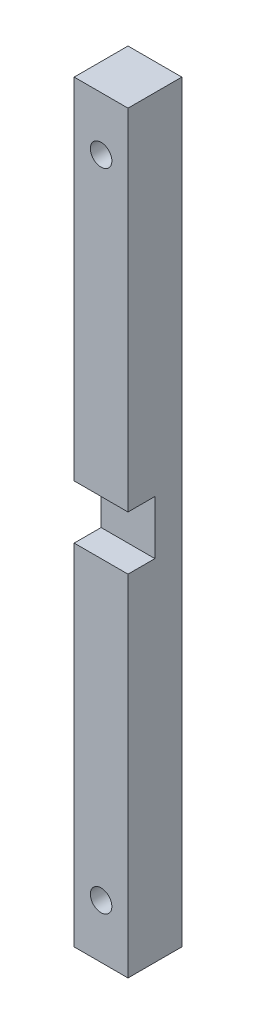
ISO-10303-21;
HEADER;
FILE_DESCRIPTION(('STEP AP214'),'2;1');
FILE_NAME('part.step','',(''),(''),'','','');
FILE_SCHEMA(('AUTOMOTIVE_DESIGN { 1 0 10303 214 1 1 1 1 }'));
ENDSEC;
DATA;
#1=APPLICATION_CONTEXT('core data for automotive mechanical design processes');
#2=APPLICATION_PROTOCOL_DEFINITION('international standard','automotive_design',2000,#1);
#3=PRODUCT_CONTEXT('',#1,'mechanical');
#4=PRODUCT('Part','Part','',(#3));
#5=PRODUCT_RELATED_PRODUCT_CATEGORY('part','',(#4));
#6=PRODUCT_DEFINITION_FORMATION('','',#4);
#7=PRODUCT_DEFINITION_CONTEXT('part definition',#1,'design');
#8=PRODUCT_DEFINITION('design','',#6,#7);
#9=PRODUCT_DEFINITION_SHAPE('','',#8);
#10=(LENGTH_UNIT() NAMED_UNIT(*) SI_UNIT(.MILLI.,.METRE.));
#11=(NAMED_UNIT(*) PLANE_ANGLE_UNIT() SI_UNIT($,.RADIAN.));
#12=(NAMED_UNIT(*) SI_UNIT($,.STERADIAN.) SOLID_ANGLE_UNIT());
#13=UNCERTAINTY_MEASURE_WITH_UNIT(LENGTH_MEASURE(1.E-05),#10,'distance_accuracy_value','');
#14=(GEOMETRIC_REPRESENTATION_CONTEXT(3) GLOBAL_UNCERTAINTY_ASSIGNED_CONTEXT((#13)) GLOBAL_UNIT_ASSIGNED_CONTEXT((#10,
#11,#12)) REPRESENTATION_CONTEXT('',''));
#15=CARTESIAN_POINT('',(0.,0.,0.));
#16=DIRECTION('',(0.,0.,1.));
#17=DIRECTION('',(1.,0.,0.));
#18=AXIS2_PLACEMENT_3D('',#15,#16,#17);
#19=CARTESIAN_POINT('',(0.,0.,10.));
#20=DIRECTION('',(0.,0.,1.));
#21=DIRECTION('',(1.,0.,0.));
#22=AXIS2_PLACEMENT_3D('',#19,#20,#21);
#23=PLANE('',#22);
#24=DIRECTION('',(1.,0.,0.));
#25=VECTOR('',#24,1.);
#26=CARTESIAN_POINT('',(10.,-75.,10.));
#27=LINE('',#26,#25);
#28=CARTESIAN_POINT('',(0.,-75.,10.));
#29=VERTEX_POINT('',#28);
#30=CARTESIAN_POINT('',(10.,-75.,10.));
#31=VERTEX_POINT('',#30);
#32=EDGE_CURVE('E119',#29,#31,#27,.T.);
#33=ORIENTED_EDGE('',*,*,#32,.F.);
#34=DIRECTION('',(0.,-1.,0.));
#35=VECTOR('',#34,1.);
#36=CARTESIAN_POINT('',(0.,0.,10.));
#37=LINE('',#36,#35);
#38=CARTESIAN_POINT('',(0.,-140.,10.));
#39=VERTEX_POINT('',#38);
#40=EDGE_CURVE('E92',#29,#39,#37,.T.);
#41=ORIENTED_EDGE('',*,*,#40,.T.);
#42=DIRECTION('',(1.,0.,0.));
#43=VECTOR('',#42,1.);
#44=CARTESIAN_POINT('',(0.,-140.,10.));
#45=LINE('',#44,#43);
#46=CARTESIAN_POINT('',(10.,-140.,10.));
#47=VERTEX_POINT('',#46);
#48=EDGE_CURVE('E159',#39,#47,#45,.T.);
#49=ORIENTED_EDGE('',*,*,#48,.T.);
#50=DIRECTION('',(0.,1.,0.));
#51=VECTOR('',#50,1.);
#52=CARTESIAN_POINT('',(10.,0.,10.));
#53=LINE('',#52,#51);
#54=EDGE_CURVE('E162',#47,#31,#53,.T.);
#55=ORIENTED_EDGE('',*,*,#54,.T.);
#56=EDGE_LOOP('',(#33,#41,#49,#55));
#57=FACE_BOUND('',#56,.T.);
#58=CARTESIAN_POINT('',(5.,-130.,10.));
#59=DIRECTION('',(0.,0.,1.));
#60=DIRECTION('',(1.,0.,0.));
#61=AXIS2_PLACEMENT_3D('',#58,#59,#60);
#62=CIRCLE('',#61,2.);
#63=CARTESIAN_POINT('',(7.,-130.,10.));
#64=VERTEX_POINT('',#63);
#65=EDGE_CURVE('E146',#64,#64,#62,.T.);
#66=ORIENTED_EDGE('',*,*,#65,.F.);
#67=EDGE_LOOP('',(#66));
#68=FACE_BOUND('',#67,.T.);
#69=ADVANCED_FACE('F37',(#57,#68),#23,.T.);
#70=CARTESIAN_POINT('',(0.,0.,10.));
#71=DIRECTION('',(1.,0.,0.));
#72=DIRECTION('',(0.,1.,0.));
#73=AXIS2_PLACEMENT_3D('',#70,#71,#72);
#74=PLANE('',#73);
#75=ORIENTED_EDGE('',*,*,#40,.F.);
#76=DIRECTION('',(0.,0.,1.));
#77=VECTOR('',#76,1.);
#78=CARTESIAN_POINT('',(0.,-75.,5.));
#79=LINE('',#78,#77);
#80=CARTESIAN_POINT('',(0.,-75.,5.));
#81=VERTEX_POINT('',#80);
#82=EDGE_CURVE('E144',#81,#29,#79,.T.);
#83=ORIENTED_EDGE('',*,*,#82,.F.);
#84=DIRECTION('',(0.,-1.,0.));
#85=VECTOR('',#84,1.);
#86=CARTESIAN_POINT('',(0.,-65.,5.));
#87=LINE('',#86,#85);
#88=CARTESIAN_POINT('',(0.,-65.,5.));
#89=VERTEX_POINT('',#88);
#90=EDGE_CURVE('E124',#89,#81,#87,.T.);
#91=ORIENTED_EDGE('',*,*,#90,.F.);
#92=DIRECTION('',(0.,0.,1.));
#93=VECTOR('',#92,1.);
#94=CARTESIAN_POINT('',(0.,-65.,5.));
#95=LINE('',#94,#93);
#96=CARTESIAN_POINT('',(0.,-65.,10.));
#97=VERTEX_POINT('',#96);
#98=EDGE_CURVE('E147',#89,#97,#95,.T.);
#99=ORIENTED_EDGE('',*,*,#98,.T.);
#100=CARTESIAN_POINT('',(0.,0.,10.));
#101=VERTEX_POINT('',#100);
#102=EDGE_CURVE('E157',#101,#97,#37,.T.);
#103=ORIENTED_EDGE('',*,*,#102,.F.);
#104=DIRECTION('',(0.,0.,-1.));
#105=VECTOR('',#104,1.);
#106=CARTESIAN_POINT('',(0.,0.,10.));
#107=LINE('',#106,#105);
#108=CARTESIAN_POINT('',(0.,0.,0.));
#109=VERTEX_POINT('',#108);
#110=EDGE_CURVE('E165',#101,#109,#107,.T.);
#111=ORIENTED_EDGE('',*,*,#110,.T.);
#112=DIRECTION('',(0.,-1.,0.));
#113=VECTOR('',#112,1.);
#114=CARTESIAN_POINT('',(0.,0.,0.));
#115=LINE('',#114,#113);
#116=CARTESIAN_POINT('',(0.,-140.,0.));
#117=VERTEX_POINT('',#116);
#118=EDGE_CURVE('E166',#109,#117,#115,.T.);
#119=ORIENTED_EDGE('',*,*,#118,.T.);
#120=DIRECTION('',(0.,0.,-1.));
#121=VECTOR('',#120,1.);
#122=CARTESIAN_POINT('',(0.,-140.,10.));
#123=LINE('',#122,#121);
#124=EDGE_CURVE('E11',#39,#117,#123,.T.);
#125=ORIENTED_EDGE('',*,*,#124,.F.);
#126=EDGE_LOOP('',(#75,#83,#91,#99,#103,#111,#119,#125));
#127=FACE_BOUND('',#126,.T.);
#128=ADVANCED_FACE('F39',(#127),#74,.F.);
#129=CARTESIAN_POINT('',(0.,-140.,10.));
#130=DIRECTION('',(0.,1.,0.));
#131=DIRECTION('',(0.,0.,1.));
#132=AXIS2_PLACEMENT_3D('',#129,#130,#131);
#133=PLANE('',#132);
#134=DIRECTION('',(1.,0.,0.));
#135=VECTOR('',#134,1.);
#136=CARTESIAN_POINT('',(0.,-140.,0.));
#137=LINE('',#136,#135);
#138=CARTESIAN_POINT('',(10.,-140.,0.));
#139=VERTEX_POINT('',#138);
#140=EDGE_CURVE('E169',#117,#139,#137,.T.);
#141=ORIENTED_EDGE('',*,*,#140,.T.);
#142=DIRECTION('',(0.,0.,-1.));
#143=VECTOR('',#142,1.);
#144=CARTESIAN_POINT('',(10.,-140.,10.));
#145=LINE('',#144,#143);
#146=EDGE_CURVE('E46',#47,#139,#145,.T.);
#147=ORIENTED_EDGE('',*,*,#146,.F.);
#148=ORIENTED_EDGE('',*,*,#48,.F.);
#149=ORIENTED_EDGE('',*,*,#124,.T.);
#150=EDGE_LOOP('',(#141,#147,#148,#149));
#151=FACE_BOUND('',#150,.T.);
#152=ADVANCED_FACE('F205',(#151),#133,.F.);
#153=CARTESIAN_POINT('',(10.,0.,10.));
#154=DIRECTION('',(-1.,0.,0.));
#155=DIRECTION('',(0.,-1.,0.));
#156=AXIS2_PLACEMENT_3D('',#153,#154,#155);
#157=PLANE('',#156);
#158=DIRECTION('',(0.,1.,0.));
#159=VECTOR('',#158,1.);
#160=CARTESIAN_POINT('',(10.,-65.,5.));
#161=LINE('',#160,#159);
#162=CARTESIAN_POINT('',(10.,-75.,5.));
#163=VERTEX_POINT('',#162);
#164=CARTESIAN_POINT('',(10.,-65.,5.));
#165=VERTEX_POINT('',#164);
#166=EDGE_CURVE('E130',#163,#165,#161,.T.);
#167=ORIENTED_EDGE('',*,*,#166,.F.);
#168=DIRECTION('',(0.,0.,1.));
#169=VECTOR('',#168,1.);
#170=CARTESIAN_POINT('',(10.,-75.,5.));
#171=LINE('',#170,#169);
#172=EDGE_CURVE('E114',#163,#31,#171,.T.);
#173=ORIENTED_EDGE('',*,*,#172,.T.);
#174=ORIENTED_EDGE('',*,*,#54,.F.);
#175=ORIENTED_EDGE('',*,*,#146,.T.);
#176=DIRECTION('',(0.,1.,0.));
#177=VECTOR('',#176,1.);
#178=CARTESIAN_POINT('',(10.,0.,0.));
#179=LINE('',#178,#177);
#180=CARTESIAN_POINT('',(10.,0.,0.));
#181=VERTEX_POINT('',#180);
#182=EDGE_CURVE('E171',#139,#181,#179,.T.);
#183=ORIENTED_EDGE('',*,*,#182,.T.);
#184=DIRECTION('',(0.,0.,-1.));
#185=VECTOR('',#184,1.);
#186=CARTESIAN_POINT('',(10.,0.,10.));
#187=LINE('',#186,#185);
#188=CARTESIAN_POINT('',(10.,0.,10.));
#189=VERTEX_POINT('',#188);
#190=EDGE_CURVE('E175',#189,#181,#187,.T.);
#191=ORIENTED_EDGE('',*,*,#190,.F.);
#192=CARTESIAN_POINT('',(10.,-65.,10.));
#193=VERTEX_POINT('',#192);
#194=EDGE_CURVE('E161',#193,#189,#53,.T.);
#195=ORIENTED_EDGE('',*,*,#194,.F.);
#196=DIRECTION('',(0.,0.,1.));
#197=VECTOR('',#196,1.);
#198=CARTESIAN_POINT('',(10.,-65.,5.));
#199=LINE('',#198,#197);
#200=EDGE_CURVE('E54',#165,#193,#199,.T.);
#201=ORIENTED_EDGE('',*,*,#200,.F.);
#202=EDGE_LOOP('',(#167,#173,#174,#175,#183,#191,#195,#201));
#203=FACE_BOUND('',#202,.T.);
#204=ADVANCED_FACE('F135',(#203),#157,.F.);
#205=CARTESIAN_POINT('',(0.,0.,10.));
#206=DIRECTION('',(0.,-1.,0.));
#207=DIRECTION('',(0.,0.,-1.));
#208=AXIS2_PLACEMENT_3D('',#205,#206,#207);
#209=PLANE('',#208);
#210=DIRECTION('',(-1.,0.,0.));
#211=VECTOR('',#210,1.);
#212=CARTESIAN_POINT('',(0.,0.,0.));
#213=LINE('',#212,#211);
#214=EDGE_CURVE('E84',#181,#109,#213,.T.);
#215=ORIENTED_EDGE('',*,*,#214,.T.);
#216=ORIENTED_EDGE('',*,*,#110,.F.);
#217=DIRECTION('',(-1.,0.,0.));
#218=VECTOR('',#217,1.);
#219=CARTESIAN_POINT('',(0.,0.,10.));
#220=LINE('',#219,#218);
#221=EDGE_CURVE('E63',#189,#101,#220,.T.);
#222=ORIENTED_EDGE('',*,*,#221,.F.);
#223=ORIENTED_EDGE('',*,*,#190,.T.);
#224=EDGE_LOOP('',(#215,#216,#222,#223));
#225=FACE_BOUND('',#224,.T.);
#226=ADVANCED_FACE('F210',(#225),#209,.F.);
#227=DIRECTION('',(-1.,0.,0.));
#228=VECTOR('',#227,1.);
#229=CARTESIAN_POINT('',(0.,-65.,10.));
#230=LINE('',#229,#228);
#231=EDGE_CURVE('E133',#193,#97,#230,.T.);
#232=ORIENTED_EDGE('',*,*,#231,.F.);
#233=ORIENTED_EDGE('',*,*,#194,.T.);
#234=ORIENTED_EDGE('',*,*,#221,.T.);
#235=ORIENTED_EDGE('',*,*,#102,.T.);
#236=EDGE_LOOP('',(#232,#233,#234,#235));
#237=FACE_BOUND('',#236,.T.);
#238=CARTESIAN_POINT('',(5.,-10.,10.));
#239=DIRECTION('',(0.,0.,1.));
#240=DIRECTION('',(1.,0.,0.));
#241=AXIS2_PLACEMENT_3D('',#238,#239,#240);
#242=CIRCLE('',#241,2.);
#243=CARTESIAN_POINT('',(7.,-10.,10.));
#244=VERTEX_POINT('',#243);
#245=EDGE_CURVE('E151',#244,#244,#242,.T.);
#246=ORIENTED_EDGE('',*,*,#245,.F.);
#247=EDGE_LOOP('',(#246));
#248=FACE_BOUND('',#247,.T.);
#249=ADVANCED_FACE('F201',(#237,#248),#23,.T.);
#250=CARTESIAN_POINT('',(0.,0.,0.));
#251=DIRECTION('',(0.,0.,1.));
#252=DIRECTION('',(1.,0.,0.));
#253=AXIS2_PLACEMENT_3D('',#250,#251,#252);
#254=PLANE('',#253);
#255=CARTESIAN_POINT('',(5.,-10.,0.));
#256=DIRECTION('',(0.,0.,1.));
#257=DIRECTION('',(1.,0.,0.));
#258=AXIS2_PLACEMENT_3D('',#255,#256,#257);
#259=CIRCLE('',#258,2.);
#260=CARTESIAN_POINT('',(7.,-10.,0.));
#261=VERTEX_POINT('',#260);
#262=EDGE_CURVE('E41',#261,#261,#259,.T.);
#263=ORIENTED_EDGE('',*,*,#262,.T.);
#264=EDGE_LOOP('',(#263));
#265=FACE_BOUND('',#264,.T.);
#266=CARTESIAN_POINT('',(5.,-130.,0.));
#267=DIRECTION('',(0.,0.,1.));
#268=DIRECTION('',(1.,0.,0.));
#269=AXIS2_PLACEMENT_3D('',#266,#267,#268);
#270=CIRCLE('',#269,2.);
#271=CARTESIAN_POINT('',(7.,-130.,0.));
#272=VERTEX_POINT('',#271);
#273=EDGE_CURVE('E154',#272,#272,#270,.T.);
#274=ORIENTED_EDGE('',*,*,#273,.T.);
#275=EDGE_LOOP('',(#274));
#276=FACE_BOUND('',#275,.T.);
#277=ORIENTED_EDGE('',*,*,#118,.F.);
#278=ORIENTED_EDGE('',*,*,#214,.F.);
#279=ORIENTED_EDGE('',*,*,#182,.F.);
#280=ORIENTED_EDGE('',*,*,#140,.F.);
#281=EDGE_LOOP('',(#277,#278,#279,#280));
#282=FACE_BOUND('',#281,.T.);
#283=ADVANCED_FACE('F184',(#265,#276,#282),#254,.F.);
#284=CARTESIAN_POINT('',(5.,-130.,-10.));
#285=DIRECTION('',(0.,0.,1.));
#286=DIRECTION('',(1.,0.,0.));
#287=AXIS2_PLACEMENT_3D('',#284,#285,#286);
#288=CYLINDRICAL_SURFACE('',#287,2.);
#289=ORIENTED_EDGE('',*,*,#65,.T.);
#290=EDGE_LOOP('',(#289));
#291=FACE_BOUND('',#290,.T.);
#292=ORIENTED_EDGE('',*,*,#273,.F.);
#293=EDGE_LOOP('',(#292));
#294=FACE_BOUND('',#293,.T.);
#295=ADVANCED_FACE('F188',(#291,#294),#288,.F.);
#296=CARTESIAN_POINT('',(5.,-10.,-10.));
#297=DIRECTION('',(0.,0.,1.));
#298=DIRECTION('',(1.,0.,0.));
#299=AXIS2_PLACEMENT_3D('',#296,#297,#298);
#300=CYLINDRICAL_SURFACE('',#299,2.);
#301=ORIENTED_EDGE('',*,*,#245,.T.);
#302=EDGE_LOOP('',(#301));
#303=FACE_BOUND('',#302,.T.);
#304=ORIENTED_EDGE('',*,*,#262,.F.);
#305=EDGE_LOOP('',(#304));
#306=FACE_BOUND('',#305,.T.);
#307=ADVANCED_FACE('F186',(#303,#306),#300,.F.);
#308=CARTESIAN_POINT('',(10.,-75.,5.));
#309=DIRECTION('',(0.,-1.,0.));
#310=DIRECTION('',(0.,0.,-1.));
#311=AXIS2_PLACEMENT_3D('',#308,#309,#310);
#312=PLANE('',#311);
#313=ORIENTED_EDGE('',*,*,#32,.T.);
#314=ORIENTED_EDGE('',*,*,#172,.F.);
#315=DIRECTION('',(1.,0.,0.));
#316=VECTOR('',#315,1.);
#317=CARTESIAN_POINT('',(10.,-75.,5.));
#318=LINE('',#317,#316);
#319=EDGE_CURVE('E117',#81,#163,#318,.T.);
#320=ORIENTED_EDGE('',*,*,#319,.F.);
#321=ORIENTED_EDGE('',*,*,#82,.T.);
#322=EDGE_LOOP('',(#313,#314,#320,#321));
#323=FACE_BOUND('',#322,.T.);
#324=ADVANCED_FACE('F116',(#323),#312,.F.);
#325=CARTESIAN_POINT('',(0.,-65.,5.));
#326=DIRECTION('',(0.,1.,0.));
#327=DIRECTION('',(0.,0.,1.));
#328=AXIS2_PLACEMENT_3D('',#325,#326,#327);
#329=PLANE('',#328);
#330=ORIENTED_EDGE('',*,*,#231,.T.);
#331=ORIENTED_EDGE('',*,*,#98,.F.);
#332=DIRECTION('',(-1.,0.,0.));
#333=VECTOR('',#332,1.);
#334=CARTESIAN_POINT('',(0.,-65.,5.));
#335=LINE('',#334,#333);
#336=EDGE_CURVE('E137',#165,#89,#335,.T.);
#337=ORIENTED_EDGE('',*,*,#336,.F.);
#338=ORIENTED_EDGE('',*,*,#200,.T.);
#339=EDGE_LOOP('',(#330,#331,#337,#338));
#340=FACE_BOUND('',#339,.T.);
#341=ADVANCED_FACE('F195',(#340),#329,.F.);
#342=CARTESIAN_POINT('',(0.,0.,5.));
#343=DIRECTION('',(0.,0.,1.));
#344=DIRECTION('',(1.,0.,0.));
#345=AXIS2_PLACEMENT_3D('',#342,#343,#344);
#346=PLANE('',#345);
#347=ORIENTED_EDGE('',*,*,#319,.T.);
#348=ORIENTED_EDGE('',*,*,#166,.T.);
#349=ORIENTED_EDGE('',*,*,#336,.T.);
#350=ORIENTED_EDGE('',*,*,#90,.T.);
#351=EDGE_LOOP('',(#347,#348,#349,#350));
#352=FACE_BOUND('',#351,.T.);
#353=ADVANCED_FACE('F128',(#352),#346,.T.);
#354=CLOSED_SHELL('',(#69,#128,#152,#204,#226,#249,#283,#295,#307,#324,#341,#353));
#355=MANIFOLD_SOLID_BREP('B2',#354);
#356=ADVANCED_BREP_SHAPE_REPRESENTATION('',(#18,#355),#14);
#357=SHAPE_DEFINITION_REPRESENTATION(#9,#356);
ENDSEC;
END-ISO-10303-21;
